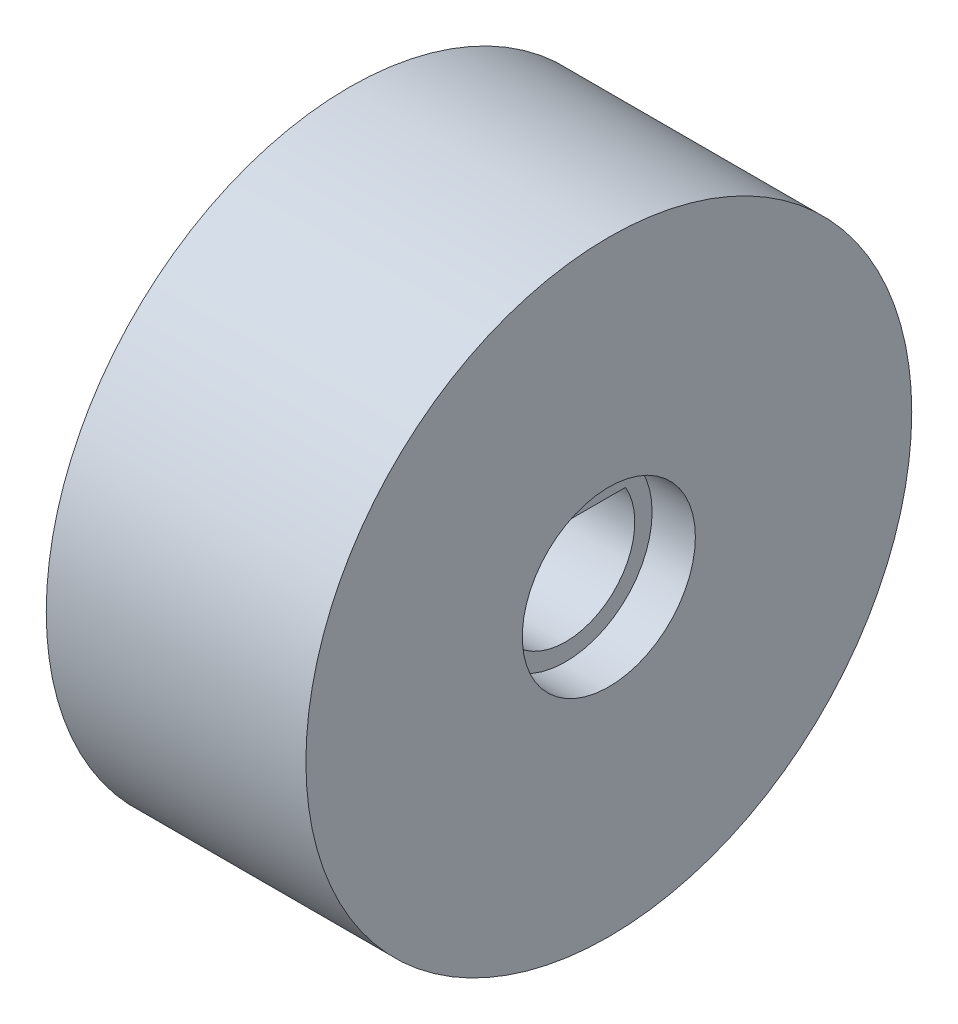
ISO-10303-21;
HEADER;
FILE_DESCRIPTION(('STEP AP214'),'2;1');
FILE_NAME('part.step','',(''),(''),'','','');
FILE_SCHEMA(('AUTOMOTIVE_DESIGN { 1 0 10303 214 1 1 1 1 }'));
ENDSEC;
DATA;
#1=APPLICATION_CONTEXT('core data for automotive mechanical design processes');
#2=APPLICATION_PROTOCOL_DEFINITION('international standard','automotive_design',2000,#1);
#3=PRODUCT_CONTEXT('',#1,'mechanical');
#4=PRODUCT('Part','Part','',(#3));
#5=PRODUCT_RELATED_PRODUCT_CATEGORY('part','',(#4));
#6=PRODUCT_DEFINITION_FORMATION('','',#4);
#7=PRODUCT_DEFINITION_CONTEXT('part definition',#1,'design');
#8=PRODUCT_DEFINITION('design','',#6,#7);
#9=PRODUCT_DEFINITION_SHAPE('','',#8);
#10=(LENGTH_UNIT() NAMED_UNIT(*) SI_UNIT(.MILLI.,.METRE.));
#11=(NAMED_UNIT(*) PLANE_ANGLE_UNIT() SI_UNIT($,.RADIAN.));
#12=(NAMED_UNIT(*) SI_UNIT($,.STERADIAN.) SOLID_ANGLE_UNIT());
#13=UNCERTAINTY_MEASURE_WITH_UNIT(LENGTH_MEASURE(1.E-05),#10,'distance_accuracy_value','');
#14=(GEOMETRIC_REPRESENTATION_CONTEXT(3) GLOBAL_UNCERTAINTY_ASSIGNED_CONTEXT((#13)) GLOBAL_UNIT_ASSIGNED_CONTEXT((#10,
#11,#12)) REPRESENTATION_CONTEXT('',''));
#15=CARTESIAN_POINT('',(0.,0.,0.));
#16=DIRECTION('',(0.,0.,1.));
#17=DIRECTION('',(1.,0.,0.));
#18=AXIS2_PLACEMENT_3D('',#15,#16,#17);
#19=CARTESIAN_POINT('',(30.,0.,0.));
#20=DIRECTION('',(-1.,0.,0.));
#21=DIRECTION('',(0.,0.,1.));
#22=AXIS2_PLACEMENT_3D('',#19,#20,#21);
#23=CYLINDRICAL_SURFACE('',#22,35.);
#24=CARTESIAN_POINT('',(30.,0.,0.));
#25=DIRECTION('',(1.,0.,0.));
#26=DIRECTION('',(0.,0.,-1.));
#27=AXIS2_PLACEMENT_3D('',#24,#25,#26);
#28=CIRCLE('',#27,35.);
#29=CARTESIAN_POINT('',(30.,0.,-35.));
#30=VERTEX_POINT('',#29);
#31=EDGE_CURVE('E11',#30,#30,#28,.T.);
#32=ORIENTED_EDGE('',*,*,#31,.F.);
#33=EDGE_LOOP('',(#32));
#34=FACE_BOUND('',#33,.T.);
#35=CARTESIAN_POINT('',(0.,0.,0.));
#36=DIRECTION('',(1.,0.,0.));
#37=DIRECTION('',(0.,0.,-1.));
#38=AXIS2_PLACEMENT_3D('',#35,#36,#37);
#39=CIRCLE('',#38,35.);
#40=CARTESIAN_POINT('',(0.,0.,-35.));
#41=VERTEX_POINT('',#40);
#42=EDGE_CURVE('E42',#41,#41,#39,.T.);
#43=ORIENTED_EDGE('',*,*,#42,.T.);
#44=EDGE_LOOP('',(#43));
#45=FACE_BOUND('',#44,.T.);
#46=ADVANCED_FACE('F39',(#34,#45),#23,.T.);
#47=CARTESIAN_POINT('',(30.,0.,0.));
#48=DIRECTION('',(1.,0.,0.));
#49=DIRECTION('',(0.,0.,-1.));
#50=AXIS2_PLACEMENT_3D('',#47,#48,#49);
#51=PLANE('',#50);
#52=CARTESIAN_POINT('',(30.,0.,0.));
#53=DIRECTION('',(1.,0.,0.));
#54=DIRECTION('',(0.,0.,-1.));
#55=AXIS2_PLACEMENT_3D('',#52,#53,#54);
#56=CIRCLE('',#55,10.);
#57=CARTESIAN_POINT('',(30.,0.,-10.));
#58=VERTEX_POINT('',#57);
#59=EDGE_CURVE('E69',#58,#58,#56,.T.);
#60=ORIENTED_EDGE('',*,*,#59,.F.);
#61=EDGE_LOOP('',(#60));
#62=FACE_BOUND('',#61,.T.);
#63=ORIENTED_EDGE('',*,*,#31,.T.);
#64=EDGE_LOOP('',(#63));
#65=FACE_BOUND('',#64,.T.);
#66=ADVANCED_FACE('F93',(#62,#65),#51,.T.);
#67=CARTESIAN_POINT('',(0.,0.,0.));
#68=DIRECTION('',(1.,0.,0.));
#69=DIRECTION('',(0.,0.,-1.));
#70=AXIS2_PLACEMENT_3D('',#67,#68,#69);
#71=PLANE('',#70);
#72=ORIENTED_EDGE('',*,*,#42,.F.);
#73=EDGE_LOOP('',(#72));
#74=FACE_BOUND('',#73,.T.);
#75=ADVANCED_FACE('F96',(#74),#71,.F.);
#76=CARTESIAN_POINT('',(25.,0.,0.));
#77=DIRECTION('',(1.,0.,0.));
#78=DIRECTION('',(0.,0.,-1.));
#79=AXIS2_PLACEMENT_3D('',#76,#77,#78);
#80=CYLINDRICAL_SURFACE('',#79,10.);
#81=CARTESIAN_POINT('',(25.,0.,0.));
#82=DIRECTION('',(1.,0.,0.));
#83=DIRECTION('',(0.,0.,-1.));
#84=AXIS2_PLACEMENT_3D('',#81,#82,#83);
#85=CIRCLE('',#84,10.);
#86=CARTESIAN_POINT('',(25.,0.,-10.));
#87=VERTEX_POINT('',#86);
#88=EDGE_CURVE('E85',#87,#87,#85,.T.);
#89=ORIENTED_EDGE('',*,*,#88,.F.);
#90=EDGE_LOOP('',(#89));
#91=FACE_BOUND('',#90,.T.);
#92=ORIENTED_EDGE('',*,*,#59,.T.);
#93=EDGE_LOOP('',(#92));
#94=FACE_BOUND('',#93,.T.);
#95=ADVANCED_FACE('F91',(#91,#94),#80,.F.);
#96=CARTESIAN_POINT('',(25.,0.,0.));
#97=DIRECTION('',(1.,0.,0.));
#98=DIRECTION('',(0.,0.,-1.));
#99=AXIS2_PLACEMENT_3D('',#96,#97,#98);
#100=PLANE('',#99);
#101=CARTESIAN_POINT('',(25.,0.,0.));
#102=DIRECTION('',(1.,0.,0.));
#103=DIRECTION('',(0.,0.,-1.));
#104=AXIS2_PLACEMENT_3D('',#101,#102,#103);
#105=CIRCLE('',#104,8.);
#106=CARTESIAN_POINT('',(25.,4.,6.92820323027551));
#107=VERTEX_POINT('',#106);
#108=CARTESIAN_POINT('',(25.,4.,-6.92820323027551));
#109=VERTEX_POINT('',#108);
#110=EDGE_CURVE('E53',#107,#109,#105,.T.);
#111=ORIENTED_EDGE('',*,*,#110,.F.);
#112=DIRECTION('',(0.,0.,1.));
#113=VECTOR('',#112,1.);
#114=CARTESIAN_POINT('',(25.,4.,6.92820323027551));
#115=LINE('',#114,#113);
#116=EDGE_CURVE('E73',#109,#107,#115,.T.);
#117=ORIENTED_EDGE('',*,*,#116,.F.);
#118=EDGE_LOOP('',(#111,#117));
#119=FACE_BOUND('',#118,.T.);
#120=ORIENTED_EDGE('',*,*,#88,.T.);
#121=EDGE_LOOP('',(#120));
#122=FACE_BOUND('',#121,.T.);
#123=ADVANCED_FACE('F77',(#119,#122),#100,.T.);
#124=CARTESIAN_POINT('',(10.,0.,0.));
#125=DIRECTION('',(1.,0.,0.));
#126=DIRECTION('',(0.,0.,-1.));
#127=AXIS2_PLACEMENT_3D('',#124,#125,#126);
#128=CYLINDRICAL_SURFACE('',#127,8.);
#129=ORIENTED_EDGE('',*,*,#110,.T.);
#130=DIRECTION('',(1.,0.,0.));
#131=VECTOR('',#130,1.);
#132=CARTESIAN_POINT('',(10.,4.,-6.92820323027551));
#133=LINE('',#132,#131);
#134=CARTESIAN_POINT('',(10.,4.,-6.92820323027551));
#135=VERTEX_POINT('',#134);
#136=EDGE_CURVE('E70',#135,#109,#133,.T.);
#137=ORIENTED_EDGE('',*,*,#136,.F.);
#138=CARTESIAN_POINT('',(10.,0.,0.));
#139=DIRECTION('',(1.,0.,0.));
#140=DIRECTION('',(0.,0.,-1.));
#141=AXIS2_PLACEMENT_3D('',#138,#139,#140);
#142=CIRCLE('',#141,8.);
#143=CARTESIAN_POINT('',(10.,4.,6.92820323027551));
#144=VERTEX_POINT('',#143);
#145=EDGE_CURVE('E67',#144,#135,#142,.T.);
#146=ORIENTED_EDGE('',*,*,#145,.F.);
#147=DIRECTION('',(1.,0.,0.));
#148=VECTOR('',#147,1.);
#149=CARTESIAN_POINT('',(10.,4.,6.92820323027551));
#150=LINE('',#149,#148);
#151=EDGE_CURVE('E61',#144,#107,#150,.T.);
#152=ORIENTED_EDGE('',*,*,#151,.T.);
#153=EDGE_LOOP('',(#129,#137,#146,#152));
#154=FACE_BOUND('',#153,.T.);
#155=ADVANCED_FACE('F65',(#154),#128,.F.);
#156=CARTESIAN_POINT('',(10.,4.,6.92820323027551));
#157=DIRECTION('',(0.,1.,0.));
#158=DIRECTION('',(0.,0.,1.));
#159=AXIS2_PLACEMENT_3D('',#156,#157,#158);
#160=PLANE('',#159);
#161=ORIENTED_EDGE('',*,*,#116,.T.);
#162=ORIENTED_EDGE('',*,*,#151,.F.);
#163=DIRECTION('',(0.,0.,1.));
#164=VECTOR('',#163,1.);
#165=CARTESIAN_POINT('',(10.,4.,6.92820323027551));
#166=LINE('',#165,#164);
#167=EDGE_CURVE('E81',#135,#144,#166,.T.);
#168=ORIENTED_EDGE('',*,*,#167,.F.);
#169=ORIENTED_EDGE('',*,*,#136,.T.);
#170=EDGE_LOOP('',(#161,#162,#168,#169));
#171=FACE_BOUND('',#170,.T.);
#172=ADVANCED_FACE('F74',(#171),#160,.F.);
#173=CARTESIAN_POINT('',(10.,0.,0.));
#174=DIRECTION('',(1.,0.,0.));
#175=DIRECTION('',(0.,0.,-1.));
#176=AXIS2_PLACEMENT_3D('',#173,#174,#175);
#177=PLANE('',#176);
#178=ORIENTED_EDGE('',*,*,#145,.T.);
#179=ORIENTED_EDGE('',*,*,#167,.T.);
#180=EDGE_LOOP('',(#178,#179));
#181=FACE_BOUND('',#180,.T.);
#182=ADVANCED_FACE('F118',(#181),#177,.T.);
#183=CLOSED_SHELL('',(#46,#66,#75,#95,#123,#155,#172,#182));
#184=MANIFOLD_SOLID_BREP('B2',#183);
#185=ADVANCED_BREP_SHAPE_REPRESENTATION('',(#18,#184),#14);
#186=SHAPE_DEFINITION_REPRESENTATION(#9,#185);
ENDSEC;
END-ISO-10303-21;
